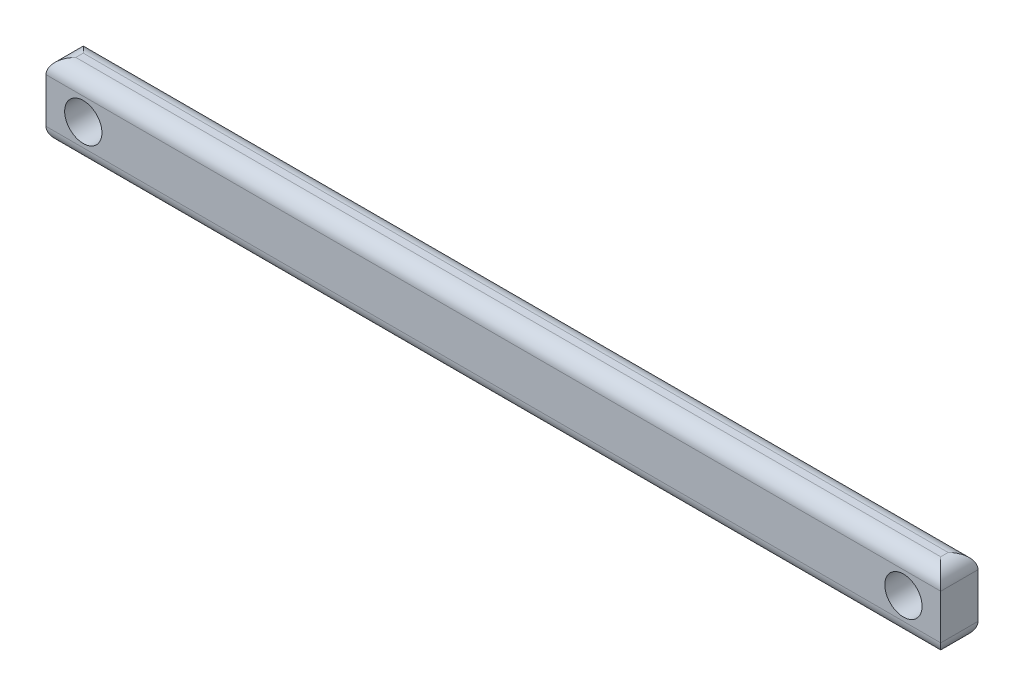
ISO-10303-21;
HEADER;
FILE_DESCRIPTION(('STEP AP214'),'2;1');
FILE_NAME('part.step','',(''),(''),'','','');
FILE_SCHEMA(('AUTOMOTIVE_DESIGN { 1 0 10303 214 1 1 1 1 }'));
ENDSEC;
DATA;
#1=APPLICATION_CONTEXT('core data for automotive mechanical design processes');
#2=APPLICATION_PROTOCOL_DEFINITION('international standard','automotive_design',2000,#1);
#3=PRODUCT_CONTEXT('',#1,'mechanical');
#4=PRODUCT('Part','Part','',(#3));
#5=PRODUCT_RELATED_PRODUCT_CATEGORY('part','',(#4));
#6=PRODUCT_DEFINITION_FORMATION('','',#4);
#7=PRODUCT_DEFINITION_CONTEXT('part definition',#1,'design');
#8=PRODUCT_DEFINITION('design','',#6,#7);
#9=PRODUCT_DEFINITION_SHAPE('','',#8);
#10=(LENGTH_UNIT() NAMED_UNIT(*) SI_UNIT(.MILLI.,.METRE.));
#11=(NAMED_UNIT(*) PLANE_ANGLE_UNIT() SI_UNIT($,.RADIAN.));
#12=(NAMED_UNIT(*) SI_UNIT($,.STERADIAN.) SOLID_ANGLE_UNIT());
#13=UNCERTAINTY_MEASURE_WITH_UNIT(LENGTH_MEASURE(1.E-05),#10,'distance_accuracy_value','');
#14=(GEOMETRIC_REPRESENTATION_CONTEXT(3) GLOBAL_UNCERTAINTY_ASSIGNED_CONTEXT((#13)) GLOBAL_UNIT_ASSIGNED_CONTEXT((#10,
#11,#12)) REPRESENTATION_CONTEXT('',''));
#15=CARTESIAN_POINT('',(0.,0.,0.));
#16=DIRECTION('',(0.,0.,1.));
#17=DIRECTION('',(1.,0.,0.));
#18=AXIS2_PLACEMENT_3D('',#15,#16,#17);
#19=CARTESIAN_POINT('',(0.,0.,25.));
#20=DIRECTION('',(0.,0.,1.));
#21=DIRECTION('',(1.,0.,0.));
#22=AXIS2_PLACEMENT_3D('',#19,#20,#21);
#23=PLANE('',#22);
#24=CARTESIAN_POINT('',(-575.,25.,25.));
#25=DIRECTION('',(0.,0.,1.));
#26=DIRECTION('',(1.,0.,0.));
#27=AXIS2_PLACEMENT_3D('',#24,#25,#26);
#28=CIRCLE('',#27,12.5);
#29=CARTESIAN_POINT('',(-562.5,25.,25.));
#30=VERTEX_POINT('',#29);
#31=EDGE_CURVE('E142',#30,#30,#28,.T.);
#32=ORIENTED_EDGE('',*,*,#31,.F.);
#33=EDGE_LOOP('',(#32));
#34=FACE_BOUND('',#33,.T.);
#35=DIRECTION('',(0.,-1.,0.));
#36=VECTOR('',#35,1.);
#37=CARTESIAN_POINT('',(-600.,0.,25.));
#38=LINE('',#37,#36);
#39=CARTESIAN_POINT('',(-600.,39.9999999999999,25.));
#40=VERTEX_POINT('',#39);
#41=CARTESIAN_POINT('',(-600.,9.99999999999993,25.));
#42=VERTEX_POINT('',#41);
#43=EDGE_CURVE('E130',#40,#42,#38,.T.);
#44=ORIENTED_EDGE('',*,*,#43,.T.);
#45=DIRECTION('',(1.,0.,0.));
#46=VECTOR('',#45,1.);
#47=CARTESIAN_POINT('',(0.,10.,25.));
#48=LINE('',#47,#46);
#49=CARTESIAN_POINT('',(0.,10.,25.));
#50=VERTEX_POINT('',#49);
#51=EDGE_CURVE('E11',#42,#50,#48,.T.);
#52=ORIENTED_EDGE('',*,*,#51,.T.);
#53=DIRECTION('',(0.,1.,0.));
#54=VECTOR('',#53,1.);
#55=CARTESIAN_POINT('',(0.,0.,25.));
#56=LINE('',#55,#54);
#57=CARTESIAN_POINT('',(0.,40.,25.));
#58=VERTEX_POINT('',#57);
#59=EDGE_CURVE('E138',#50,#58,#56,.T.);
#60=ORIENTED_EDGE('',*,*,#59,.T.);
#61=DIRECTION('',(-1.,0.,0.));
#62=VECTOR('',#61,1.);
#63=CARTESIAN_POINT('',(-600.,39.9999999999999,25.));
#64=LINE('',#63,#62);
#65=EDGE_CURVE('E42',#58,#40,#64,.T.);
#66=ORIENTED_EDGE('',*,*,#65,.T.);
#67=EDGE_LOOP('',(#44,#52,#60,#66));
#68=FACE_BOUND('',#67,.T.);
#69=CARTESIAN_POINT('',(-25.,25.,25.));
#70=DIRECTION('',(0.,0.,1.));
#71=DIRECTION('',(1.,0.,0.));
#72=AXIS2_PLACEMENT_3D('',#69,#70,#71);
#73=CIRCLE('',#72,12.5);
#74=CARTESIAN_POINT('',(-12.5,25.,25.));
#75=VERTEX_POINT('',#74);
#76=EDGE_CURVE('E344',#75,#75,#73,.T.);
#77=ORIENTED_EDGE('',*,*,#76,.F.);
#78=EDGE_LOOP('',(#77));
#79=FACE_BOUND('',#78,.T.);
#80=ADVANCED_FACE('F33',(#34,#68,#79),#23,.T.);
#81=CARTESIAN_POINT('',(0.,0.,0.));
#82=DIRECTION('',(0.,0.,1.));
#83=DIRECTION('',(1.,0.,0.));
#84=AXIS2_PLACEMENT_3D('',#81,#82,#83);
#85=PLANE('',#84);
#86=CARTESIAN_POINT('',(-575.,25.,0.));
#87=DIRECTION('',(0.,0.,1.));
#88=DIRECTION('',(1.,0.,0.));
#89=AXIS2_PLACEMENT_3D('',#86,#87,#88);
#90=CIRCLE('',#89,12.5);
#91=CARTESIAN_POINT('',(-562.5,25.,0.));
#92=VERTEX_POINT('',#91);
#93=EDGE_CURVE('E348',#92,#92,#90,.T.);
#94=ORIENTED_EDGE('',*,*,#93,.T.);
#95=EDGE_LOOP('',(#94));
#96=FACE_BOUND('',#95,.T.);
#97=DIRECTION('',(0.,1.,0.));
#98=VECTOR('',#97,1.);
#99=CARTESIAN_POINT('',(0.,0.,0.));
#100=LINE('',#99,#98);
#101=CARTESIAN_POINT('',(0.,10.,0.));
#102=VERTEX_POINT('',#101);
#103=CARTESIAN_POINT('',(0.,40.,0.));
#104=VERTEX_POINT('',#103);
#105=EDGE_CURVE('E139',#102,#104,#100,.T.);
#106=ORIENTED_EDGE('',*,*,#105,.F.);
#107=DIRECTION('',(1.,0.,0.));
#108=VECTOR('',#107,1.);
#109=CARTESIAN_POINT('',(0.,10.,0.));
#110=LINE('',#109,#108);
#111=CARTESIAN_POINT('',(-600.,9.99999999999993,0.));
#112=VERTEX_POINT('',#111);
#113=EDGE_CURVE('E120',#102,#112,#110,.F.);
#114=ORIENTED_EDGE('',*,*,#113,.T.);
#115=DIRECTION('',(0.,-1.,0.));
#116=VECTOR('',#115,1.);
#117=CARTESIAN_POINT('',(-600.,0.,0.));
#118=LINE('',#117,#116);
#119=CARTESIAN_POINT('',(-600.,39.9999999999999,0.));
#120=VERTEX_POINT('',#119);
#121=EDGE_CURVE('E128',#120,#112,#118,.T.);
#122=ORIENTED_EDGE('',*,*,#121,.F.);
#123=DIRECTION('',(-1.,0.,0.));
#124=VECTOR('',#123,1.);
#125=CARTESIAN_POINT('',(0.,40.,0.));
#126=LINE('',#125,#124);
#127=EDGE_CURVE('E113',#120,#104,#126,.F.);
#128=ORIENTED_EDGE('',*,*,#127,.T.);
#129=EDGE_LOOP('',(#106,#114,#122,#128));
#130=FACE_BOUND('',#129,.T.);
#131=CARTESIAN_POINT('',(-25.,25.,0.));
#132=DIRECTION('',(0.,0.,1.));
#133=DIRECTION('',(1.,0.,0.));
#134=AXIS2_PLACEMENT_3D('',#131,#132,#133);
#135=CIRCLE('',#134,12.5);
#136=CARTESIAN_POINT('',(-12.5,25.,0.));
#137=VERTEX_POINT('',#136);
#138=EDGE_CURVE('E171',#137,#137,#135,.T.);
#139=ORIENTED_EDGE('',*,*,#138,.T.);
#140=EDGE_LOOP('',(#139));
#141=FACE_BOUND('',#140,.T.);
#142=ADVANCED_FACE('F135',(#96,#130,#141),#85,.F.);
#143=CARTESIAN_POINT('',(0.,0.,25.));
#144=DIRECTION('',(-1.,0.,0.));
#145=DIRECTION('',(0.,0.,1.));
#146=AXIS2_PLACEMENT_3D('',#143,#144,#145);
#147=PLANE('',#146);
#148=ORIENTED_EDGE('',*,*,#59,.F.);
#149=DIRECTION('',(0.,0.,-1.));
#150=VECTOR('',#149,1.);
#151=CARTESIAN_POINT('',(0.,10.,25.));
#152=LINE('',#151,#150);
#153=EDGE_CURVE('E121',#50,#102,#152,.T.);
#154=ORIENTED_EDGE('',*,*,#153,.T.);
#155=ORIENTED_EDGE('',*,*,#105,.T.);
#156=DIRECTION('',(0.,0.,-1.));
#157=VECTOR('',#156,1.);
#158=CARTESIAN_POINT('',(0.,40.,25.));
#159=LINE('',#158,#157);
#160=EDGE_CURVE('E50',#104,#58,#159,.F.);
#161=ORIENTED_EDGE('',*,*,#160,.T.);
#162=EDGE_LOOP('',(#148,#154,#155,#161));
#163=FACE_BOUND('',#162,.T.);
#164=ADVANCED_FACE('F189',(#163),#147,.F.);
#165=CARTESIAN_POINT('',(0.,50.,25.));
#166=DIRECTION('',(0.,-1.,0.));
#167=DIRECTION('',(1.,0.,0.));
#168=AXIS2_PLACEMENT_3D('',#165,#166,#167);
#169=PLANE('',#168);
#170=DIRECTION('',(0.,0.,-1.));
#171=VECTOR('',#170,1.);
#172=CARTESIAN_POINT('',(-10.,50.,25.));
#173=LINE('',#172,#171);
#174=CARTESIAN_POINT('',(-10.,50.,15.));
#175=VERTEX_POINT('',#174);
#176=CARTESIAN_POINT('',(-10.,50.,10.));
#177=VERTEX_POINT('',#176);
#178=EDGE_CURVE('E148',#175,#177,#173,.T.);
#179=ORIENTED_EDGE('',*,*,#178,.T.);
#180=DIRECTION('',(-1.,0.,0.));
#181=VECTOR('',#180,1.);
#182=CARTESIAN_POINT('',(0.,50.,10.));
#183=LINE('',#182,#181);
#184=CARTESIAN_POINT('',(-590.,49.9999999999999,10.));
#185=VERTEX_POINT('',#184);
#186=EDGE_CURVE('E151',#177,#185,#183,.T.);
#187=ORIENTED_EDGE('',*,*,#186,.T.);
#188=DIRECTION('',(0.,0.,-1.));
#189=VECTOR('',#188,1.);
#190=CARTESIAN_POINT('',(-590.,49.9999999999999,25.));
#191=LINE('',#190,#189);
#192=CARTESIAN_POINT('',(-590.,49.9999999999999,15.));
#193=VERTEX_POINT('',#192);
#194=EDGE_CURVE('E107',#185,#193,#191,.F.);
#195=ORIENTED_EDGE('',*,*,#194,.T.);
#196=DIRECTION('',(-1.,0.,0.));
#197=VECTOR('',#196,1.);
#198=CARTESIAN_POINT('',(0.,50.,15.));
#199=LINE('',#198,#197);
#200=EDGE_CURVE('E132',#193,#175,#199,.F.);
#201=ORIENTED_EDGE('',*,*,#200,.T.);
#202=EDGE_LOOP('',(#179,#187,#195,#201));
#203=FACE_BOUND('',#202,.T.);
#204=ADVANCED_FACE('F200',(#203),#169,.F.);
#205=CARTESIAN_POINT('',(-600.,0.,25.));
#206=DIRECTION('',(1.,0.,0.));
#207=DIRECTION('',(0.,0.,-1.));
#208=AXIS2_PLACEMENT_3D('',#205,#206,#207);
#209=PLANE('',#208);
#210=ORIENTED_EDGE('',*,*,#43,.F.);
#211=DIRECTION('',(0.,0.,-1.));
#212=VECTOR('',#211,1.);
#213=CARTESIAN_POINT('',(-600.,39.9999999999999,25.));
#214=LINE('',#213,#212);
#215=EDGE_CURVE('E105',#40,#120,#214,.T.);
#216=ORIENTED_EDGE('',*,*,#215,.T.);
#217=ORIENTED_EDGE('',*,*,#121,.T.);
#218=DIRECTION('',(0.,0.,-1.));
#219=VECTOR('',#218,1.);
#220=CARTESIAN_POINT('',(-600.,9.99999999999993,25.));
#221=LINE('',#220,#219);
#222=EDGE_CURVE('E133',#112,#42,#221,.F.);
#223=ORIENTED_EDGE('',*,*,#222,.T.);
#224=EDGE_LOOP('',(#210,#216,#217,#223));
#225=FACE_BOUND('',#224,.T.);
#226=ADVANCED_FACE('F126',(#225),#209,.F.);
#227=CARTESIAN_POINT('',(0.,0.,25.));
#228=DIRECTION('',(0.,1.,0.));
#229=DIRECTION('',(-1.,0.,0.));
#230=AXIS2_PLACEMENT_3D('',#227,#228,#229);
#231=PLANE('',#230);
#232=DIRECTION('',(0.,0.,-1.));
#233=VECTOR('',#232,1.);
#234=CARTESIAN_POINT('',(-590.,0.,25.));
#235=LINE('',#234,#233);
#236=CARTESIAN_POINT('',(-590.,0.,15.));
#237=VERTEX_POINT('',#236);
#238=CARTESIAN_POINT('',(-590.,0.,10.));
#239=VERTEX_POINT('',#238);
#240=EDGE_CURVE('E157',#237,#239,#235,.T.);
#241=ORIENTED_EDGE('',*,*,#240,.T.);
#242=DIRECTION('',(1.,0.,0.));
#243=VECTOR('',#242,1.);
#244=CARTESIAN_POINT('',(0.,0.,10.));
#245=LINE('',#244,#243);
#246=CARTESIAN_POINT('',(-10.,0.,10.));
#247=VERTEX_POINT('',#246);
#248=EDGE_CURVE('E160',#239,#247,#245,.T.);
#249=ORIENTED_EDGE('',*,*,#248,.T.);
#250=DIRECTION('',(0.,0.,-1.));
#251=VECTOR('',#250,1.);
#252=CARTESIAN_POINT('',(-10.,0.,25.));
#253=LINE('',#252,#251);
#254=CARTESIAN_POINT('',(-10.,0.,15.));
#255=VERTEX_POINT('',#254);
#256=EDGE_CURVE('E155',#247,#255,#253,.F.);
#257=ORIENTED_EDGE('',*,*,#256,.T.);
#258=DIRECTION('',(1.,0.,0.));
#259=VECTOR('',#258,1.);
#260=CARTESIAN_POINT('',(-600.,0.,15.));
#261=LINE('',#260,#259);
#262=EDGE_CURVE('E153',#255,#237,#261,.F.);
#263=ORIENTED_EDGE('',*,*,#262,.T.);
#264=EDGE_LOOP('',(#241,#249,#257,#263));
#265=FACE_BOUND('',#264,.T.);
#266=ADVANCED_FACE('F207',(#265),#231,.F.);
#267=CARTESIAN_POINT('',(-575.,25.,25.));
#268=DIRECTION('',(0.,0.,-1.));
#269=DIRECTION('',(-1.,0.,0.));
#270=AXIS2_PLACEMENT_3D('',#267,#268,#269);
#271=CYLINDRICAL_SURFACE('',#270,12.5);
#272=ORIENTED_EDGE('',*,*,#31,.T.);
#273=EDGE_LOOP('',(#272));
#274=FACE_BOUND('',#273,.T.);
#275=ORIENTED_EDGE('',*,*,#93,.F.);
#276=EDGE_LOOP('',(#275));
#277=FACE_BOUND('',#276,.T.);
#278=ADVANCED_FACE('F220',(#274,#277),#271,.F.);
#279=CARTESIAN_POINT('',(-25.,25.,25.));
#280=DIRECTION('',(0.,0.,-1.));
#281=DIRECTION('',(-1.,0.,0.));
#282=AXIS2_PLACEMENT_3D('',#279,#280,#281);
#283=CYLINDRICAL_SURFACE('',#282,12.5);
#284=ORIENTED_EDGE('',*,*,#76,.T.);
#285=EDGE_LOOP('',(#284));
#286=FACE_BOUND('',#285,.T.);
#287=ORIENTED_EDGE('',*,*,#138,.F.);
#288=EDGE_LOOP('',(#287));
#289=FACE_BOUND('',#288,.T.);
#290=ADVANCED_FACE('F228',(#286,#289),#283,.F.);
#291=CARTESIAN_POINT('',(-10.,40.,25.));
#292=DIRECTION('',(0.,0.,-1.));
#293=DIRECTION('',(-1.,0.,0.));
#294=AXIS2_PLACEMENT_3D('',#291,#292,#293);
#295=CYLINDRICAL_SURFACE('',#294,10.);
#296=CARTESIAN_POINT('',(-10.,40.,10.));
#297=DIRECTION('',(-0.707106781186547,0.,-0.707106781186547));
#298=DIRECTION('',(-0.707106781186547,0.,0.707106781186547));
#299=AXIS2_PLACEMENT_3D('',#296,#297,#298);
#300=ELLIPSE('',#299,14.1421356237309,10.);
#301=EDGE_CURVE('E116',#177,#104,#300,.T.);
#302=ORIENTED_EDGE('',*,*,#301,.F.);
#303=ORIENTED_EDGE('',*,*,#178,.F.);
#304=CARTESIAN_POINT('',(-10.,40.,15.));
#305=DIRECTION('',(0.707106781186547,0.,-0.707106781186547));
#306=DIRECTION('',(0.707106781186547,0.,0.707106781186547));
#307=AXIS2_PLACEMENT_3D('',#304,#305,#306);
#308=ELLIPSE('',#307,14.1421356237309,10.);
#309=EDGE_CURVE('E168',#58,#175,#308,.F.);
#310=ORIENTED_EDGE('',*,*,#309,.F.);
#311=ORIENTED_EDGE('',*,*,#160,.F.);
#312=EDGE_LOOP('',(#302,#303,#310,#311));
#313=FACE_BOUND('',#312,.T.);
#314=ADVANCED_FACE('F195',(#313),#295,.T.);
#315=CARTESIAN_POINT('',(0.,40.,15.));
#316=DIRECTION('',(1.,0.,0.));
#317=DIRECTION('',(0.,1.,0.));
#318=AXIS2_PLACEMENT_3D('',#315,#316,#317);
#319=CYLINDRICAL_SURFACE('',#318,10.);
#320=ORIENTED_EDGE('',*,*,#309,.T.);
#321=ORIENTED_EDGE('',*,*,#200,.F.);
#322=CARTESIAN_POINT('',(-590.,39.9999999999999,15.));
#323=DIRECTION('',(0.707106781186547,0.,0.707106781186547));
#324=DIRECTION('',(0.707106781186547,0.,-0.707106781186547));
#325=AXIS2_PLACEMENT_3D('',#322,#323,#324);
#326=ELLIPSE('',#325,14.1421356237309,10.);
#327=EDGE_CURVE('E110',#40,#193,#326,.F.);
#328=ORIENTED_EDGE('',*,*,#327,.F.);
#329=ORIENTED_EDGE('',*,*,#65,.F.);
#330=EDGE_LOOP('',(#320,#321,#328,#329));
#331=FACE_BOUND('',#330,.T.);
#332=ADVANCED_FACE('F198',(#331),#319,.T.);
#333=CARTESIAN_POINT('',(0.,40.,10.));
#334=DIRECTION('',(-1.,0.,0.));
#335=DIRECTION('',(0.,-1.,0.));
#336=AXIS2_PLACEMENT_3D('',#333,#334,#335);
#337=CYLINDRICAL_SURFACE('',#336,10.);
#338=ORIENTED_EDGE('',*,*,#301,.T.);
#339=ORIENTED_EDGE('',*,*,#127,.F.);
#340=CARTESIAN_POINT('',(-590.,39.9999999999999,10.));
#341=DIRECTION('',(-0.707106781186547,0.,0.707106781186547));
#342=DIRECTION('',(-0.707106781186547,0.,-0.707106781186547));
#343=AXIS2_PLACEMENT_3D('',#340,#341,#342);
#344=ELLIPSE('',#343,14.1421356237309,10.);
#345=EDGE_CURVE('E101',#185,#120,#344,.T.);
#346=ORIENTED_EDGE('',*,*,#345,.F.);
#347=ORIENTED_EDGE('',*,*,#186,.F.);
#348=EDGE_LOOP('',(#338,#339,#346,#347));
#349=FACE_BOUND('',#348,.T.);
#350=ADVANCED_FACE('F114',(#349),#337,.T.);
#351=CARTESIAN_POINT('',(-590.,39.9999999999999,25.));
#352=DIRECTION('',(0.,0.,-1.));
#353=DIRECTION('',(-1.,0.,0.));
#354=AXIS2_PLACEMENT_3D('',#351,#352,#353);
#355=CYLINDRICAL_SURFACE('',#354,10.);
#356=ORIENTED_EDGE('',*,*,#327,.T.);
#357=ORIENTED_EDGE('',*,*,#194,.F.);
#358=ORIENTED_EDGE('',*,*,#345,.T.);
#359=ORIENTED_EDGE('',*,*,#215,.F.);
#360=EDGE_LOOP('',(#356,#357,#358,#359));
#361=FACE_BOUND('',#360,.T.);
#362=ADVANCED_FACE('F103',(#361),#355,.T.);
#363=CARTESIAN_POINT('',(-10.,10.,25.));
#364=DIRECTION('',(0.,0.,-1.));
#365=DIRECTION('',(-1.,0.,0.));
#366=AXIS2_PLACEMENT_3D('',#363,#364,#365);
#367=CYLINDRICAL_SURFACE('',#366,10.);
#368=CARTESIAN_POINT('',(-10.,10.,10.));
#369=DIRECTION('',(0.707106781186547,0.,0.707106781186547));
#370=DIRECTION('',(0.707106781186547,0.,-0.707106781186547));
#371=AXIS2_PLACEMENT_3D('',#368,#369,#370);
#372=ELLIPSE('',#371,14.1421356237309,10.);
#373=EDGE_CURVE('E175',#102,#247,#372,.F.);
#374=ORIENTED_EDGE('',*,*,#373,.F.);
#375=ORIENTED_EDGE('',*,*,#153,.F.);
#376=CARTESIAN_POINT('',(-10.,10.,15.));
#377=DIRECTION('',(-0.707106781186547,0.,0.707106781186547));
#378=DIRECTION('',(-0.707106781186547,0.,-0.707106781186547));
#379=AXIS2_PLACEMENT_3D('',#376,#377,#378);
#380=ELLIPSE('',#379,14.1421356237309,10.);
#381=EDGE_CURVE('E37',#255,#50,#380,.T.);
#382=ORIENTED_EDGE('',*,*,#381,.F.);
#383=ORIENTED_EDGE('',*,*,#256,.F.);
#384=EDGE_LOOP('',(#374,#375,#382,#383));
#385=FACE_BOUND('',#384,.T.);
#386=ADVANCED_FACE('F35',(#385),#367,.T.);
#387=CARTESIAN_POINT('',(0.,10.,15.));
#388=DIRECTION('',(-1.,0.,0.));
#389=DIRECTION('',(0.,-1.,0.));
#390=AXIS2_PLACEMENT_3D('',#387,#388,#389);
#391=CYLINDRICAL_SURFACE('',#390,10.);
#392=ORIENTED_EDGE('',*,*,#381,.T.);
#393=ORIENTED_EDGE('',*,*,#51,.F.);
#394=CARTESIAN_POINT('',(-590.,9.99999999999993,15.));
#395=DIRECTION('',(-0.707106781186547,0.,-0.707106781186547));
#396=DIRECTION('',(-0.707106781186547,0.,0.707106781186547));
#397=AXIS2_PLACEMENT_3D('',#394,#395,#396);
#398=ELLIPSE('',#397,14.1421356237309,10.);
#399=EDGE_CURVE('E174',#237,#42,#398,.T.);
#400=ORIENTED_EDGE('',*,*,#399,.F.);
#401=ORIENTED_EDGE('',*,*,#262,.F.);
#402=EDGE_LOOP('',(#392,#393,#400,#401));
#403=FACE_BOUND('',#402,.T.);
#404=ADVANCED_FACE('F184',(#403),#391,.T.);
#405=CARTESIAN_POINT('',(0.,10.,10.));
#406=DIRECTION('',(1.,0.,0.));
#407=DIRECTION('',(0.,1.,0.));
#408=AXIS2_PLACEMENT_3D('',#405,#406,#407);
#409=CYLINDRICAL_SURFACE('',#408,10.);
#410=ORIENTED_EDGE('',*,*,#373,.T.);
#411=ORIENTED_EDGE('',*,*,#248,.F.);
#412=CARTESIAN_POINT('',(-590.,9.99999999999993,10.));
#413=DIRECTION('',(0.707106781186547,0.,-0.707106781186547));
#414=DIRECTION('',(0.707106781186547,0.,0.707106781186547));
#415=AXIS2_PLACEMENT_3D('',#412,#413,#414);
#416=ELLIPSE('',#415,14.1421356237309,10.);
#417=EDGE_CURVE('E172',#112,#239,#416,.F.);
#418=ORIENTED_EDGE('',*,*,#417,.F.);
#419=ORIENTED_EDGE('',*,*,#113,.F.);
#420=EDGE_LOOP('',(#410,#411,#418,#419));
#421=FACE_BOUND('',#420,.T.);
#422=ADVANCED_FACE('F234',(#421),#409,.T.);
#423=CARTESIAN_POINT('',(-590.,9.99999999999993,25.));
#424=DIRECTION('',(0.,0.,-1.));
#425=DIRECTION('',(-1.,0.,0.));
#426=AXIS2_PLACEMENT_3D('',#423,#424,#425);
#427=CYLINDRICAL_SURFACE('',#426,10.);
#428=ORIENTED_EDGE('',*,*,#399,.T.);
#429=ORIENTED_EDGE('',*,*,#222,.F.);
#430=ORIENTED_EDGE('',*,*,#417,.T.);
#431=ORIENTED_EDGE('',*,*,#240,.F.);
#432=EDGE_LOOP('',(#428,#429,#430,#431));
#433=FACE_BOUND('',#432,.T.);
#434=ADVANCED_FACE('F232',(#433),#427,.T.);
#435=CLOSED_SHELL('',(#80,#142,#164,#204,#226,#266,#278,#290,#314,#332,#350,#362,#386,#404,#422,#434));
#436=MANIFOLD_SOLID_BREP('B2',#435);
#437=ADVANCED_BREP_SHAPE_REPRESENTATION('',(#18,#436),#14);
#438=SHAPE_DEFINITION_REPRESENTATION(#9,#437);
ENDSEC;
END-ISO-10303-21;
